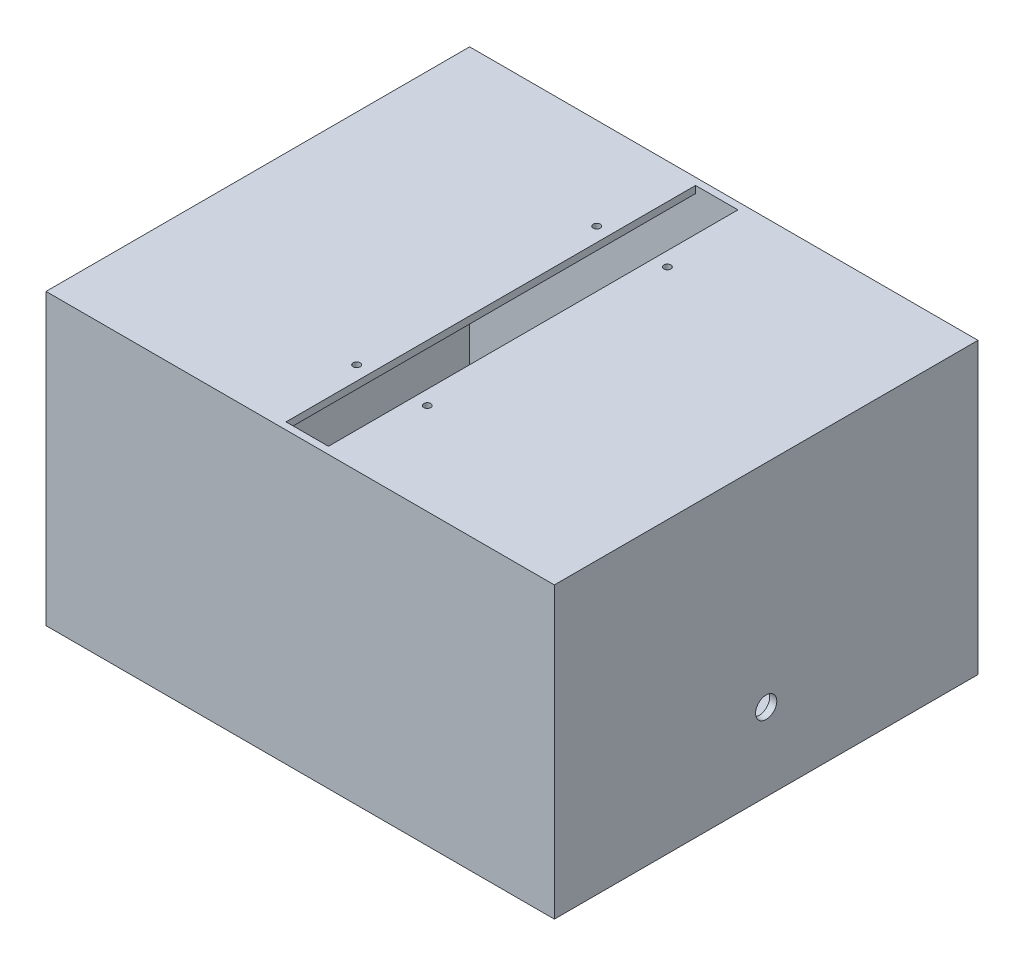
ISO-10303-21;
HEADER;
FILE_DESCRIPTION(('STEP AP214'),'2;1');
FILE_NAME('part.step','',(''),(''),'','','');
FILE_SCHEMA(('AUTOMOTIVE_DESIGN { 1 0 10303 214 1 1 1 1 }'));
ENDSEC;
DATA;
#1=APPLICATION_CONTEXT('core data for automotive mechanical design processes');
#2=APPLICATION_PROTOCOL_DEFINITION('international standard','automotive_design',2000,#1);
#3=PRODUCT_CONTEXT('',#1,'mechanical');
#4=PRODUCT('Part','Part','',(#3));
#5=PRODUCT_RELATED_PRODUCT_CATEGORY('part','',(#4));
#6=PRODUCT_DEFINITION_FORMATION('','',#4);
#7=PRODUCT_DEFINITION_CONTEXT('part definition',#1,'design');
#8=PRODUCT_DEFINITION('design','',#6,#7);
#9=PRODUCT_DEFINITION_SHAPE('','',#8);
#10=(LENGTH_UNIT() NAMED_UNIT(*) SI_UNIT(.MILLI.,.METRE.));
#11=(NAMED_UNIT(*) PLANE_ANGLE_UNIT() SI_UNIT($,.RADIAN.));
#12=(NAMED_UNIT(*) SI_UNIT($,.STERADIAN.) SOLID_ANGLE_UNIT());
#13=UNCERTAINTY_MEASURE_WITH_UNIT(LENGTH_MEASURE(1.E-05),#10,'distance_accuracy_value','');
#14=(GEOMETRIC_REPRESENTATION_CONTEXT(3) GLOBAL_UNCERTAINTY_ASSIGNED_CONTEXT((#13)) GLOBAL_UNIT_ASSIGNED_CONTEXT((#10,
#11,#12)) REPRESENTATION_CONTEXT('',''));
#15=CARTESIAN_POINT('',(0.,0.,0.));
#16=DIRECTION('',(0.,0.,1.));
#17=DIRECTION('',(1.,0.,0.));
#18=AXIS2_PLACEMENT_3D('',#15,#16,#17);
#19=CARTESIAN_POINT('',(0.,-5.,0.));
#20=DIRECTION('',(0.,1.,0.));
#21=DIRECTION('',(0.,0.,1.));
#22=AXIS2_PLACEMENT_3D('',#19,#20,#21);
#23=PLANE('',#22);
#24=CARTESIAN_POINT('',(25.,-5.,85.));
#25=DIRECTION('',(0.,1.,0.));
#26=DIRECTION('',(0.,0.,1.));
#27=AXIS2_PLACEMENT_3D('',#24,#25,#26);
#28=CIRCLE('',#27,2.5);
#29=CARTESIAN_POINT('',(25.,-5.,87.5));
#30=VERTEX_POINT('',#29);
#31=EDGE_CURVE('E225',#30,#30,#28,.F.);
#32=ORIENTED_EDGE('',*,*,#31,.F.);
#33=EDGE_LOOP('',(#32));
#34=FACE_BOUND('',#33,.T.);
#35=CARTESIAN_POINT('',(25.0000000000002,-5.,-85.));
#36=DIRECTION('',(0.,1.,0.));
#37=DIRECTION('',(0.,0.,1.));
#38=AXIS2_PLACEMENT_3D('',#35,#36,#37);
#39=CIRCLE('',#38,2.5);
#40=CARTESIAN_POINT('',(25.0000000000002,-5.,-82.5));
#41=VERTEX_POINT('',#40);
#42=EDGE_CURVE('E215',#41,#41,#39,.F.);
#43=ORIENTED_EDGE('',*,*,#42,.F.);
#44=EDGE_LOOP('',(#43));
#45=FACE_BOUND('',#44,.T.);
#46=DIRECTION('',(-1.,0.,0.));
#47=VECTOR('',#46,1.);
#48=CARTESIAN_POINT('',(-175.,-5.,145.));
#49=LINE('',#48,#47);
#50=CARTESIAN_POINT('',(175.,-5.,145.));
#51=VERTEX_POINT('',#50);
#52=CARTESIAN_POINT('',(15.,-5.,145.));
#53=VERTEX_POINT('',#52);
#54=EDGE_CURVE('E293',#51,#53,#49,.T.);
#55=ORIENTED_EDGE('',*,*,#54,.T.);
#56=DIRECTION('',(0.,0.,-1.));
#57=VECTOR('',#56,1.);
#58=CARTESIAN_POINT('',(15.,-5.,0.));
#59=LINE('',#58,#57);
#60=CARTESIAN_POINT('',(15.,-5.,-145.));
#61=VERTEX_POINT('',#60);
#62=EDGE_CURVE('E11',#53,#61,#59,.T.);
#63=ORIENTED_EDGE('',*,*,#62,.T.);
#64=DIRECTION('',(1.,0.,0.));
#65=VECTOR('',#64,1.);
#66=CARTESIAN_POINT('',(-175.,-5.,-145.));
#67=LINE('',#66,#65);
#68=CARTESIAN_POINT('',(175.,-5.,-145.));
#69=VERTEX_POINT('',#68);
#70=EDGE_CURVE('E301',#61,#69,#67,.T.);
#71=ORIENTED_EDGE('',*,*,#70,.T.);
#72=DIRECTION('',(0.,0.,1.));
#73=VECTOR('',#72,1.);
#74=CARTESIAN_POINT('',(175.,-5.,-145.));
#75=LINE('',#74,#73);
#76=EDGE_CURVE('E287',#69,#51,#75,.T.);
#77=ORIENTED_EDGE('',*,*,#76,.T.);
#78=EDGE_LOOP('',(#55,#63,#71,#77));
#79=FACE_BOUND('',#78,.T.);
#80=ADVANCED_FACE('F43',(#34,#45,#79),#23,.F.);
#81=CARTESIAN_POINT('',(-180.,-200.,150.));
#82=DIRECTION('',(-1.,0.,0.));
#83=DIRECTION('',(0.,0.,1.));
#84=AXIS2_PLACEMENT_3D('',#81,#82,#83);
#85=PLANE('',#84);
#86=CARTESIAN_POINT('',(-180.,-150.,0.));
#87=DIRECTION('',(-1.,0.,0.));
#88=DIRECTION('',(0.,0.,1.));
#89=AXIS2_PLACEMENT_3D('',#86,#87,#88);
#90=CIRCLE('',#89,7.5);
#91=CARTESIAN_POINT('',(-180.,-150.,7.50000000000002));
#92=VERTEX_POINT('',#91);
#93=EDGE_CURVE('E246',#92,#92,#90,.T.);
#94=ORIENTED_EDGE('',*,*,#93,.F.);
#95=EDGE_LOOP('',(#94));
#96=FACE_BOUND('',#95,.T.);
#97=DIRECTION('',(0.,0.,1.));
#98=VECTOR('',#97,1.);
#99=CARTESIAN_POINT('',(-180.,0.,150.));
#100=LINE('',#99,#98);
#101=CARTESIAN_POINT('',(-180.,0.,-150.));
#102=VERTEX_POINT('',#101);
#103=CARTESIAN_POINT('',(-180.,0.,150.));
#104=VERTEX_POINT('',#103);
#105=EDGE_CURVE('E326',#102,#104,#100,.T.);
#106=ORIENTED_EDGE('',*,*,#105,.F.);
#107=DIRECTION('',(0.,1.,0.));
#108=VECTOR('',#107,1.);
#109=CARTESIAN_POINT('',(-180.,-200.,-150.));
#110=LINE('',#109,#108);
#111=CARTESIAN_POINT('',(-180.,-205.,-150.));
#112=VERTEX_POINT('',#111);
#113=EDGE_CURVE('E354',#112,#102,#110,.T.);
#114=ORIENTED_EDGE('',*,*,#113,.F.);
#115=DIRECTION('',(0.,0.,-1.));
#116=VECTOR('',#115,1.);
#117=CARTESIAN_POINT('',(-180.,-205.,150.));
#118=LINE('',#117,#116);
#119=CARTESIAN_POINT('',(-180.,-205.,150.));
#120=VERTEX_POINT('',#119);
#121=EDGE_CURVE('E197',#120,#112,#118,.T.);
#122=ORIENTED_EDGE('',*,*,#121,.F.);
#123=DIRECTION('',(0.,1.,0.));
#124=VECTOR('',#123,1.);
#125=CARTESIAN_POINT('',(-180.,-200.,150.));
#126=LINE('',#125,#124);
#127=EDGE_CURVE('E353',#120,#104,#126,.T.);
#128=ORIENTED_EDGE('',*,*,#127,.T.);
#129=EDGE_LOOP('',(#106,#114,#122,#128));
#130=FACE_BOUND('',#129,.T.);
#131=ADVANCED_FACE('F45',(#96,#130),#85,.T.);
#132=CARTESIAN_POINT('',(-180.,-200.,-150.));
#133=DIRECTION('',(0.,0.,-1.));
#134=DIRECTION('',(-1.,0.,0.));
#135=AXIS2_PLACEMENT_3D('',#132,#133,#134);
#136=PLANE('',#135);
#137=DIRECTION('',(0.,1.,0.));
#138=VECTOR('',#137,1.);
#139=CARTESIAN_POINT('',(-100.,-200.,-150.));
#140=LINE('',#139,#138);
#141=CARTESIAN_POINT('',(-100.,-200.,-150.));
#142=VERTEX_POINT('',#141);
#143=CARTESIAN_POINT('',(-100.,-173.,-150.));
#144=VERTEX_POINT('',#143);
#145=EDGE_CURVE('E60',#142,#144,#140,.T.);
#146=ORIENTED_EDGE('',*,*,#145,.F.);
#147=DIRECTION('',(-1.,0.,0.));
#148=VECTOR('',#147,1.);
#149=CARTESIAN_POINT('',(99.9999999999999,-200.,-150.));
#150=LINE('',#149,#148);
#151=CARTESIAN_POINT('',(99.9999999999999,-200.,-150.));
#152=VERTEX_POINT('',#151);
#153=EDGE_CURVE('E181',#152,#142,#150,.T.);
#154=ORIENTED_EDGE('',*,*,#153,.F.);
#155=DIRECTION('',(0.,-1.,0.));
#156=VECTOR('',#155,1.);
#157=CARTESIAN_POINT('',(99.9999999999999,-200.,-150.));
#158=LINE('',#157,#156);
#159=CARTESIAN_POINT('',(99.9999999999999,-173.,-150.));
#160=VERTEX_POINT('',#159);
#161=EDGE_CURVE('E163',#160,#152,#158,.T.);
#162=ORIENTED_EDGE('',*,*,#161,.F.);
#163=DIRECTION('',(1.,0.,0.));
#164=VECTOR('',#163,1.);
#165=CARTESIAN_POINT('',(99.9999999999999,-173.,-150.));
#166=LINE('',#165,#164);
#167=EDGE_CURVE('E174',#144,#160,#166,.T.);
#168=ORIENTED_EDGE('',*,*,#167,.F.);
#169=EDGE_LOOP('',(#146,#154,#162,#168));
#170=FACE_BOUND('',#169,.T.);
#171=DIRECTION('',(-1.,0.,0.));
#172=VECTOR('',#171,1.);
#173=CARTESIAN_POINT('',(-180.,0.,-150.));
#174=LINE('',#173,#172);
#175=CARTESIAN_POINT('',(180.,0.,-150.));
#176=VERTEX_POINT('',#175);
#177=EDGE_CURVE('E349',#176,#102,#174,.T.);
#178=ORIENTED_EDGE('',*,*,#177,.F.);
#179=DIRECTION('',(0.,1.,0.));
#180=VECTOR('',#179,1.);
#181=CARTESIAN_POINT('',(180.,-200.,-150.));
#182=LINE('',#181,#180);
#183=CARTESIAN_POINT('',(180.,-205.,-150.));
#184=VERTEX_POINT('',#183);
#185=EDGE_CURVE('E357',#184,#176,#182,.T.);
#186=ORIENTED_EDGE('',*,*,#185,.F.);
#187=DIRECTION('',(1.,0.,0.));
#188=VECTOR('',#187,1.);
#189=CARTESIAN_POINT('',(-180.,-205.,-150.));
#190=LINE('',#189,#188);
#191=EDGE_CURVE('E202',#112,#184,#190,.T.);
#192=ORIENTED_EDGE('',*,*,#191,.F.);
#193=ORIENTED_EDGE('',*,*,#113,.T.);
#194=EDGE_LOOP('',(#178,#186,#192,#193));
#195=FACE_BOUND('',#194,.T.);
#196=ADVANCED_FACE('F179',(#170,#195),#136,.T.);
#197=CARTESIAN_POINT('',(180.,-200.,150.));
#198=DIRECTION('',(1.,0.,0.));
#199=DIRECTION('',(0.,0.,-1.));
#200=AXIS2_PLACEMENT_3D('',#197,#198,#199);
#201=PLANE('',#200);
#202=CARTESIAN_POINT('',(180.,-150.,0.));
#203=DIRECTION('',(-1.,0.,0.));
#204=DIRECTION('',(0.,0.,1.));
#205=AXIS2_PLACEMENT_3D('',#202,#203,#204);
#206=CIRCLE('',#205,7.5);
#207=CARTESIAN_POINT('',(180.,-150.,7.50000000000002));
#208=VERTEX_POINT('',#207);
#209=EDGE_CURVE('E247',#208,#208,#206,.T.);
#210=ORIENTED_EDGE('',*,*,#209,.T.);
#211=EDGE_LOOP('',(#210));
#212=FACE_BOUND('',#211,.T.);
#213=DIRECTION('',(0.,0.,-1.));
#214=VECTOR('',#213,1.);
#215=CARTESIAN_POINT('',(180.,0.,150.));
#216=LINE('',#215,#214);
#217=CARTESIAN_POINT('',(180.,0.,150.));
#218=VERTEX_POINT('',#217);
#219=EDGE_CURVE('E345',#218,#176,#216,.T.);
#220=ORIENTED_EDGE('',*,*,#219,.F.);
#221=DIRECTION('',(0.,1.,0.));
#222=VECTOR('',#221,1.);
#223=CARTESIAN_POINT('',(180.,-200.,150.));
#224=LINE('',#223,#222);
#225=CARTESIAN_POINT('',(180.,-205.,150.));
#226=VERTEX_POINT('',#225);
#227=EDGE_CURVE('E360',#226,#218,#224,.T.);
#228=ORIENTED_EDGE('',*,*,#227,.F.);
#229=DIRECTION('',(0.,0.,1.));
#230=VECTOR('',#229,1.);
#231=CARTESIAN_POINT('',(180.,-205.,150.));
#232=LINE('',#231,#230);
#233=EDGE_CURVE('E206',#184,#226,#232,.T.);
#234=ORIENTED_EDGE('',*,*,#233,.F.);
#235=ORIENTED_EDGE('',*,*,#185,.T.);
#236=EDGE_LOOP('',(#220,#228,#234,#235));
#237=FACE_BOUND('',#236,.T.);
#238=ADVANCED_FACE('F451',(#212,#237),#201,.T.);
#239=CARTESIAN_POINT('',(-180.,-200.,150.));
#240=DIRECTION('',(0.,0.,1.));
#241=DIRECTION('',(1.,0.,0.));
#242=AXIS2_PLACEMENT_3D('',#239,#240,#241);
#243=PLANE('',#242);
#244=DIRECTION('',(1.,0.,0.));
#245=VECTOR('',#244,1.);
#246=CARTESIAN_POINT('',(-180.,0.,150.));
#247=LINE('',#246,#245);
#248=EDGE_CURVE('E341',#104,#218,#247,.T.);
#249=ORIENTED_EDGE('',*,*,#248,.F.);
#250=ORIENTED_EDGE('',*,*,#127,.F.);
#251=DIRECTION('',(-1.,0.,0.));
#252=VECTOR('',#251,1.);
#253=CARTESIAN_POINT('',(-180.,-205.,150.));
#254=LINE('',#253,#252);
#255=EDGE_CURVE('E210',#226,#120,#254,.T.);
#256=ORIENTED_EDGE('',*,*,#255,.F.);
#257=ORIENTED_EDGE('',*,*,#227,.T.);
#258=EDGE_LOOP('',(#249,#250,#256,#257));
#259=FACE_BOUND('',#258,.T.);
#260=ADVANCED_FACE('F447',(#259),#243,.T.);
#261=CARTESIAN_POINT('',(0.,0.,0.));
#262=DIRECTION('',(0.,-1.,0.));
#263=DIRECTION('',(0.,0.,-1.));
#264=AXIS2_PLACEMENT_3D('',#261,#262,#263);
#265=PLANE('',#264);
#266=CARTESIAN_POINT('',(-25.0000000000001,0.,85.));
#267=DIRECTION('',(0.,1.,0.));
#268=DIRECTION('',(0.,0.,-1.));
#269=AXIS2_PLACEMENT_3D('',#266,#267,#268);
#270=CIRCLE('',#269,2.5);
#271=CARTESIAN_POINT('',(-25.0000000000001,0.,82.5));
#272=VERTEX_POINT('',#271);
#273=EDGE_CURVE('E229',#272,#272,#270,.T.);
#274=ORIENTED_EDGE('',*,*,#273,.F.);
#275=EDGE_LOOP('',(#274));
#276=FACE_BOUND('',#275,.T.);
#277=CARTESIAN_POINT('',(25.,0.,85.));
#278=DIRECTION('',(0.,1.,0.));
#279=DIRECTION('',(0.,0.,1.));
#280=AXIS2_PLACEMENT_3D('',#277,#278,#279);
#281=CIRCLE('',#280,2.5);
#282=CARTESIAN_POINT('',(25.,0.,87.5));
#283=VERTEX_POINT('',#282);
#284=EDGE_CURVE('E220',#283,#283,#281,.T.);
#285=ORIENTED_EDGE('',*,*,#284,.F.);
#286=EDGE_LOOP('',(#285));
#287=FACE_BOUND('',#286,.T.);
#288=CARTESIAN_POINT('',(25.0000000000002,0.,-85.));
#289=DIRECTION('',(0.,1.,0.));
#290=DIRECTION('',(0.,0.,-1.));
#291=AXIS2_PLACEMENT_3D('',#288,#289,#290);
#292=CIRCLE('',#291,2.5);
#293=CARTESIAN_POINT('',(25.0000000000002,0.,-87.5));
#294=VERTEX_POINT('',#293);
#295=EDGE_CURVE('E219',#294,#294,#292,.T.);
#296=ORIENTED_EDGE('',*,*,#295,.F.);
#297=EDGE_LOOP('',(#296));
#298=FACE_BOUND('',#297,.T.);
#299=CARTESIAN_POINT('',(-25.,0.,-85.));
#300=DIRECTION('',(0.,1.,0.));
#301=DIRECTION('',(0.,0.,1.));
#302=AXIS2_PLACEMENT_3D('',#299,#300,#301);
#303=CIRCLE('',#302,2.5);
#304=CARTESIAN_POINT('',(-25.,0.,-82.5));
#305=VERTEX_POINT('',#304);
#306=EDGE_CURVE('E224',#305,#305,#303,.T.);
#307=ORIENTED_EDGE('',*,*,#306,.F.);
#308=EDGE_LOOP('',(#307));
#309=FACE_BOUND('',#308,.T.);
#310=DIRECTION('',(-1.,0.,0.));
#311=VECTOR('',#310,1.);
#312=CARTESIAN_POINT('',(-15.,0.,-145.));
#313=LINE('',#312,#311);
#314=CARTESIAN_POINT('',(15.,0.,-145.));
#315=VERTEX_POINT('',#314);
#316=CARTESIAN_POINT('',(-15.,0.,-145.));
#317=VERTEX_POINT('',#316);
#318=EDGE_CURVE('E261',#315,#317,#313,.T.);
#319=ORIENTED_EDGE('',*,*,#318,.F.);
#320=DIRECTION('',(0.,0.,-1.));
#321=VECTOR('',#320,1.);
#322=CARTESIAN_POINT('',(15.,0.,145.));
#323=LINE('',#322,#321);
#324=CARTESIAN_POINT('',(15.,0.,145.));
#325=VERTEX_POINT('',#324);
#326=EDGE_CURVE('E258',#325,#315,#323,.T.);
#327=ORIENTED_EDGE('',*,*,#326,.F.);
#328=DIRECTION('',(1.,0.,0.));
#329=VECTOR('',#328,1.);
#330=CARTESIAN_POINT('',(-15.,0.,145.));
#331=LINE('',#330,#329);
#332=CARTESIAN_POINT('',(-15.,0.,145.));
#333=VERTEX_POINT('',#332);
#334=EDGE_CURVE('E269',#333,#325,#331,.T.);
#335=ORIENTED_EDGE('',*,*,#334,.F.);
#336=DIRECTION('',(0.,0.,1.));
#337=VECTOR('',#336,1.);
#338=CARTESIAN_POINT('',(-15.,0.,145.));
#339=LINE('',#338,#337);
#340=EDGE_CURVE('E265',#317,#333,#339,.T.);
#341=ORIENTED_EDGE('',*,*,#340,.F.);
#342=EDGE_LOOP('',(#319,#327,#335,#341));
#343=FACE_BOUND('',#342,.T.);
#344=ORIENTED_EDGE('',*,*,#105,.T.);
#345=ORIENTED_EDGE('',*,*,#248,.T.);
#346=ORIENTED_EDGE('',*,*,#219,.T.);
#347=ORIENTED_EDGE('',*,*,#177,.T.);
#348=EDGE_LOOP('',(#344,#345,#346,#347));
#349=FACE_BOUND('',#348,.T.);
#350=ADVANCED_FACE('F401',(#276,#287,#298,#309,#343,#349),#265,.F.);
#351=CARTESIAN_POINT('',(175.,-5.,-145.));
#352=DIRECTION('',(1.,0.,0.));
#353=DIRECTION('',(0.,0.,-1.));
#354=AXIS2_PLACEMENT_3D('',#351,#352,#353);
#355=PLANE('',#354);
#356=CARTESIAN_POINT('',(175.,-150.,0.));
#357=DIRECTION('',(1.,0.,0.));
#358=DIRECTION('',(0.,0.,-1.));
#359=AXIS2_PLACEMENT_3D('',#356,#357,#358);
#360=CIRCLE('',#359,7.5);
#361=CARTESIAN_POINT('',(175.,-150.,-7.49999999999998));
#362=VERTEX_POINT('',#361);
#363=EDGE_CURVE('E254',#362,#362,#360,.T.);
#364=ORIENTED_EDGE('',*,*,#363,.T.);
#365=EDGE_LOOP('',(#364));
#366=FACE_BOUND('',#365,.T.);
#367=DIRECTION('',(0.,0.,1.));
#368=VECTOR('',#367,1.);
#369=CARTESIAN_POINT('',(175.,-200.,-145.));
#370=LINE('',#369,#368);
#371=CARTESIAN_POINT('',(175.,-200.,-145.));
#372=VERTEX_POINT('',#371);
#373=CARTESIAN_POINT('',(175.,-200.,145.));
#374=VERTEX_POINT('',#373);
#375=EDGE_CURVE('E277',#372,#374,#370,.T.);
#376=ORIENTED_EDGE('',*,*,#375,.T.);
#377=DIRECTION('',(0.,-1.,0.));
#378=VECTOR('',#377,1.);
#379=CARTESIAN_POINT('',(175.,-5.,145.));
#380=LINE('',#379,#378);
#381=EDGE_CURVE('E306',#51,#374,#380,.T.);
#382=ORIENTED_EDGE('',*,*,#381,.F.);
#383=ORIENTED_EDGE('',*,*,#76,.F.);
#384=DIRECTION('',(0.,-1.,0.));
#385=VECTOR('',#384,1.);
#386=CARTESIAN_POINT('',(175.,-5.,-145.));
#387=LINE('',#386,#385);
#388=EDGE_CURVE('E322',#69,#372,#387,.T.);
#389=ORIENTED_EDGE('',*,*,#388,.T.);
#390=EDGE_LOOP('',(#376,#382,#383,#389));
#391=FACE_BOUND('',#390,.T.);
#392=ADVANCED_FACE('F410',(#366,#391),#355,.F.);
#393=CARTESIAN_POINT('',(-175.,-5.,-145.));
#394=DIRECTION('',(0.,0.,-1.));
#395=DIRECTION('',(-1.,0.,0.));
#396=AXIS2_PLACEMENT_3D('',#393,#394,#395);
#397=PLANE('',#396);
#398=DIRECTION('',(1.,0.,0.));
#399=VECTOR('',#398,1.);
#400=CARTESIAN_POINT('',(-175.,-200.,-145.));
#401=LINE('',#400,#399);
#402=CARTESIAN_POINT('',(-175.,-200.,-145.));
#403=VERTEX_POINT('',#402);
#404=CARTESIAN_POINT('',(-100.,-200.,-145.));
#405=VERTEX_POINT('',#404);
#406=EDGE_CURVE('E292',#403,#405,#401,.T.);
#407=ORIENTED_EDGE('',*,*,#406,.T.);
#408=DIRECTION('',(0.,-1.,0.));
#409=VECTOR('',#408,1.);
#410=CARTESIAN_POINT('',(-100.,-200.,-145.));
#411=LINE('',#410,#409);
#412=CARTESIAN_POINT('',(-100.,-173.,-145.));
#413=VERTEX_POINT('',#412);
#414=EDGE_CURVE('E198',#413,#405,#411,.T.);
#415=ORIENTED_EDGE('',*,*,#414,.F.);
#416=DIRECTION('',(-1.,0.,0.));
#417=VECTOR('',#416,1.);
#418=CARTESIAN_POINT('',(100.,-173.,-145.));
#419=LINE('',#418,#417);
#420=CARTESIAN_POINT('',(99.9999999999999,-173.,-145.));
#421=VERTEX_POINT('',#420);
#422=EDGE_CURVE('E194',#421,#413,#419,.T.);
#423=ORIENTED_EDGE('',*,*,#422,.F.);
#424=DIRECTION('',(0.,1.,0.));
#425=VECTOR('',#424,1.);
#426=CARTESIAN_POINT('',(99.9999999999999,-200.,-145.));
#427=LINE('',#426,#425);
#428=CARTESIAN_POINT('',(99.9999999999999,-200.,-145.));
#429=VERTEX_POINT('',#428);
#430=EDGE_CURVE('E166',#429,#421,#427,.T.);
#431=ORIENTED_EDGE('',*,*,#430,.F.);
#432=EDGE_CURVE('E318',#429,#372,#401,.T.);
#433=ORIENTED_EDGE('',*,*,#432,.T.);
#434=ORIENTED_EDGE('',*,*,#388,.F.);
#435=ORIENTED_EDGE('',*,*,#70,.F.);
#436=DIRECTION('',(0.,1.,0.));
#437=VECTOR('',#436,1.);
#438=CARTESIAN_POINT('',(15.,-200.,-145.));
#439=LINE('',#438,#437);
#440=EDGE_CURVE('E273',#61,#315,#439,.T.);
#441=ORIENTED_EDGE('',*,*,#440,.T.);
#442=ORIENTED_EDGE('',*,*,#318,.T.);
#443=DIRECTION('',(0.,1.,0.));
#444=VECTOR('',#443,1.);
#445=CARTESIAN_POINT('',(-15.,-200.,-145.));
#446=LINE('',#445,#444);
#447=CARTESIAN_POINT('',(-15.,-5.,-145.));
#448=VERTEX_POINT('',#447);
#449=EDGE_CURVE('E281',#448,#317,#446,.T.);
#450=ORIENTED_EDGE('',*,*,#449,.F.);
#451=CARTESIAN_POINT('',(-175.,-5.,-145.));
#452=VERTEX_POINT('',#451);
#453=EDGE_CURVE('E302',#452,#448,#67,.T.);
#454=ORIENTED_EDGE('',*,*,#453,.F.);
#455=DIRECTION('',(0.,-1.,0.));
#456=VECTOR('',#455,1.);
#457=CARTESIAN_POINT('',(-175.,-5.,-145.));
#458=LINE('',#457,#456);
#459=EDGE_CURVE('E327',#452,#403,#458,.T.);
#460=ORIENTED_EDGE('',*,*,#459,.T.);
#461=EDGE_LOOP('',(#407,#415,#423,#431,#433,#434,#435,#441,#442,#450,#454,#460));
#462=FACE_BOUND('',#461,.T.);
#463=ADVANCED_FACE('F389',(#462),#397,.F.);
#464=CARTESIAN_POINT('',(-175.,-5.,-145.));
#465=DIRECTION('',(-1.,0.,0.));
#466=DIRECTION('',(0.,0.,1.));
#467=AXIS2_PLACEMENT_3D('',#464,#465,#466);
#468=PLANE('',#467);
#469=CARTESIAN_POINT('',(-175.,-150.,0.));
#470=DIRECTION('',(-1.,0.,0.));
#471=DIRECTION('',(0.,0.,1.));
#472=AXIS2_PLACEMENT_3D('',#469,#470,#471);
#473=CIRCLE('',#472,7.5);
#474=CARTESIAN_POINT('',(-175.,-150.,7.50000000000002));
#475=VERTEX_POINT('',#474);
#476=EDGE_CURVE('E47',#475,#475,#473,.T.);
#477=ORIENTED_EDGE('',*,*,#476,.T.);
#478=EDGE_LOOP('',(#477));
#479=FACE_BOUND('',#478,.T.);
#480=DIRECTION('',(0.,0.,-1.));
#481=VECTOR('',#480,1.);
#482=CARTESIAN_POINT('',(-175.,-200.,-145.));
#483=LINE('',#482,#481);
#484=CARTESIAN_POINT('',(-175.,-200.,145.));
#485=VERTEX_POINT('',#484);
#486=EDGE_CURVE('E314',#485,#403,#483,.T.);
#487=ORIENTED_EDGE('',*,*,#486,.T.);
#488=ORIENTED_EDGE('',*,*,#459,.F.);
#489=DIRECTION('',(0.,0.,-1.));
#490=VECTOR('',#489,1.);
#491=CARTESIAN_POINT('',(-175.,-5.,-145.));
#492=LINE('',#491,#490);
#493=CARTESIAN_POINT('',(-175.,-5.,145.));
#494=VERTEX_POINT('',#493);
#495=EDGE_CURVE('E297',#494,#452,#492,.T.);
#496=ORIENTED_EDGE('',*,*,#495,.F.);
#497=DIRECTION('',(0.,-1.,0.));
#498=VECTOR('',#497,1.);
#499=CARTESIAN_POINT('',(-175.,-5.,145.));
#500=LINE('',#499,#498);
#501=EDGE_CURVE('E331',#494,#485,#500,.T.);
#502=ORIENTED_EDGE('',*,*,#501,.T.);
#503=EDGE_LOOP('',(#487,#488,#496,#502));
#504=FACE_BOUND('',#503,.T.);
#505=ADVANCED_FACE('F394',(#479,#504),#468,.F.);
#506=CARTESIAN_POINT('',(-175.,-5.,145.));
#507=DIRECTION('',(0.,0.,1.));
#508=DIRECTION('',(1.,0.,0.));
#509=AXIS2_PLACEMENT_3D('',#506,#507,#508);
#510=PLANE('',#509);
#511=CARTESIAN_POINT('',(-15.,-5.,145.));
#512=VERTEX_POINT('',#511);
#513=EDGE_CURVE('E291',#512,#494,#49,.T.);
#514=ORIENTED_EDGE('',*,*,#513,.F.);
#515=DIRECTION('',(0.,1.,0.));
#516=VECTOR('',#515,1.);
#517=CARTESIAN_POINT('',(-15.,-200.,145.));
#518=LINE('',#517,#516);
#519=EDGE_CURVE('E278',#512,#333,#518,.T.);
#520=ORIENTED_EDGE('',*,*,#519,.T.);
#521=ORIENTED_EDGE('',*,*,#334,.T.);
#522=DIRECTION('',(0.,1.,0.));
#523=VECTOR('',#522,1.);
#524=CARTESIAN_POINT('',(15.,-200.,145.));
#525=LINE('',#524,#523);
#526=EDGE_CURVE('E274',#53,#325,#525,.T.);
#527=ORIENTED_EDGE('',*,*,#526,.F.);
#528=ORIENTED_EDGE('',*,*,#54,.F.);
#529=ORIENTED_EDGE('',*,*,#381,.T.);
#530=DIRECTION('',(-1.,0.,0.));
#531=VECTOR('',#530,1.);
#532=CARTESIAN_POINT('',(-175.,-200.,145.));
#533=LINE('',#532,#531);
#534=EDGE_CURVE('E310',#374,#485,#533,.T.);
#535=ORIENTED_EDGE('',*,*,#534,.T.);
#536=ORIENTED_EDGE('',*,*,#501,.F.);
#537=EDGE_LOOP('',(#514,#520,#521,#527,#528,#529,#535,#536));
#538=FACE_BOUND('',#537,.T.);
#539=ADVANCED_FACE('F375',(#538),#510,.F.);
#540=CARTESIAN_POINT('',(-25.0000000000001,-5.,85.));
#541=DIRECTION('',(0.,1.,0.));
#542=DIRECTION('',(0.,0.,1.));
#543=AXIS2_PLACEMENT_3D('',#540,#541,#542);
#544=CIRCLE('',#543,2.5);
#545=CARTESIAN_POINT('',(-25.0000000000001,-5.,87.5));
#546=VERTEX_POINT('',#545);
#547=EDGE_CURVE('E214',#546,#546,#544,.F.);
#548=ORIENTED_EDGE('',*,*,#547,.F.);
#549=EDGE_LOOP('',(#548));
#550=FACE_BOUND('',#549,.T.);
#551=CARTESIAN_POINT('',(-25.,-5.,-85.));
#552=DIRECTION('',(0.,1.,0.));
#553=DIRECTION('',(0.,0.,1.));
#554=AXIS2_PLACEMENT_3D('',#551,#552,#553);
#555=CIRCLE('',#554,2.5);
#556=CARTESIAN_POINT('',(-25.,-5.,-82.5));
#557=VERTEX_POINT('',#556);
#558=EDGE_CURVE('E242',#557,#557,#555,.F.);
#559=ORIENTED_EDGE('',*,*,#558,.F.);
#560=EDGE_LOOP('',(#559));
#561=FACE_BOUND('',#560,.T.);
#562=ORIENTED_EDGE('',*,*,#453,.T.);
#563=DIRECTION('',(0.,0.,1.));
#564=VECTOR('',#563,1.);
#565=CARTESIAN_POINT('',(-15.,-5.,0.));
#566=LINE('',#565,#564);
#567=EDGE_CURVE('E53',#448,#512,#566,.T.);
#568=ORIENTED_EDGE('',*,*,#567,.T.);
#569=ORIENTED_EDGE('',*,*,#513,.T.);
#570=ORIENTED_EDGE('',*,*,#495,.T.);
#571=EDGE_LOOP('',(#562,#568,#569,#570));
#572=FACE_BOUND('',#571,.T.);
#573=ADVANCED_FACE('F370',(#550,#561,#572),#23,.F.);
#574=CARTESIAN_POINT('',(15.,-200.,145.));
#575=DIRECTION('',(1.,0.,0.));
#576=DIRECTION('',(0.,0.,-1.));
#577=AXIS2_PLACEMENT_3D('',#574,#575,#576);
#578=PLANE('',#577);
#579=ORIENTED_EDGE('',*,*,#526,.T.);
#580=ORIENTED_EDGE('',*,*,#326,.T.);
#581=ORIENTED_EDGE('',*,*,#440,.F.);
#582=ORIENTED_EDGE('',*,*,#62,.F.);
#583=EDGE_LOOP('',(#579,#580,#581,#582));
#584=FACE_BOUND('',#583,.T.);
#585=ADVANCED_FACE('F413',(#584),#578,.F.);
#586=CARTESIAN_POINT('',(-15.,-200.,145.));
#587=DIRECTION('',(-1.,0.,0.));
#588=DIRECTION('',(0.,0.,1.));
#589=AXIS2_PLACEMENT_3D('',#586,#587,#588);
#590=PLANE('',#589);
#591=ORIENTED_EDGE('',*,*,#449,.T.);
#592=ORIENTED_EDGE('',*,*,#340,.T.);
#593=ORIENTED_EDGE('',*,*,#519,.F.);
#594=ORIENTED_EDGE('',*,*,#567,.F.);
#595=EDGE_LOOP('',(#591,#592,#593,#594));
#596=FACE_BOUND('',#595,.T.);
#597=ADVANCED_FACE('F397',(#596),#590,.F.);
#598=CARTESIAN_POINT('',(180.,-150.,0.));
#599=DIRECTION('',(-1.,0.,0.));
#600=DIRECTION('',(0.,0.,1.));
#601=AXIS2_PLACEMENT_3D('',#598,#599,#600);
#602=CYLINDRICAL_SURFACE('',#601,7.5);
#603=ORIENTED_EDGE('',*,*,#93,.T.);
#604=EDGE_LOOP('',(#603));
#605=FACE_BOUND('',#604,.T.);
#606=ORIENTED_EDGE('',*,*,#476,.F.);
#607=EDGE_LOOP('',(#606));
#608=FACE_BOUND('',#607,.T.);
#609=ADVANCED_FACE('F420',(#605,#608),#602,.F.);
#610=ORIENTED_EDGE('',*,*,#209,.F.);
#611=EDGE_LOOP('',(#610));
#612=FACE_BOUND('',#611,.T.);
#613=ORIENTED_EDGE('',*,*,#363,.F.);
#614=EDGE_LOOP('',(#613));
#615=FACE_BOUND('',#614,.T.);
#616=ADVANCED_FACE('F495',(#612,#615),#602,.F.);
#617=CARTESIAN_POINT('',(-25.,-12.0710678118655,-85.));
#618=DIRECTION('',(0.,1.,0.));
#619=DIRECTION('',(0.,0.,1.));
#620=AXIS2_PLACEMENT_3D('',#617,#618,#619);
#621=CYLINDRICAL_SURFACE('',#620,2.5);
#622=ORIENTED_EDGE('',*,*,#558,.T.);
#623=EDGE_LOOP('',(#622));
#624=FACE_BOUND('',#623,.T.);
#625=ORIENTED_EDGE('',*,*,#306,.T.);
#626=EDGE_LOOP('',(#625));
#627=FACE_BOUND('',#626,.T.);
#628=ADVANCED_FACE('F491',(#624,#627),#621,.F.);
#629=CARTESIAN_POINT('',(-25.0000000000001,-12.0710678118655,85.));
#630=DIRECTION('',(0.,1.,0.));
#631=DIRECTION('',(0.,0.,1.));
#632=AXIS2_PLACEMENT_3D('',#629,#630,#631);
#633=CYLINDRICAL_SURFACE('',#632,2.5);
#634=ORIENTED_EDGE('',*,*,#547,.T.);
#635=EDGE_LOOP('',(#634));
#636=FACE_BOUND('',#635,.T.);
#637=ORIENTED_EDGE('',*,*,#273,.T.);
#638=EDGE_LOOP('',(#637));
#639=FACE_BOUND('',#638,.T.);
#640=ADVANCED_FACE('F484',(#636,#639),#633,.F.);
#641=CARTESIAN_POINT('',(25.0000000000002,-12.0710678118655,-85.));
#642=DIRECTION('',(0.,1.,0.));
#643=DIRECTION('',(0.,0.,1.));
#644=AXIS2_PLACEMENT_3D('',#641,#642,#643);
#645=CYLINDRICAL_SURFACE('',#644,2.5);
#646=ORIENTED_EDGE('',*,*,#42,.T.);
#647=EDGE_LOOP('',(#646));
#648=FACE_BOUND('',#647,.T.);
#649=ORIENTED_EDGE('',*,*,#295,.T.);
#650=EDGE_LOOP('',(#649));
#651=FACE_BOUND('',#650,.T.);
#652=ADVANCED_FACE('F481',(#648,#651),#645,.F.);
#653=CARTESIAN_POINT('',(25.,-12.0710678118655,85.));
#654=DIRECTION('',(0.,1.,0.));
#655=DIRECTION('',(0.,0.,1.));
#656=AXIS2_PLACEMENT_3D('',#653,#654,#655);
#657=CYLINDRICAL_SURFACE('',#656,2.5);
#658=ORIENTED_EDGE('',*,*,#31,.T.);
#659=EDGE_LOOP('',(#658));
#660=FACE_BOUND('',#659,.T.);
#661=ORIENTED_EDGE('',*,*,#284,.T.);
#662=EDGE_LOOP('',(#661));
#663=FACE_BOUND('',#662,.T.);
#664=ADVANCED_FACE('F477',(#660,#663),#657,.F.);
#665=CARTESIAN_POINT('',(0.,-200.,0.));
#666=DIRECTION('',(0.,-1.,0.));
#667=DIRECTION('',(0.,0.,-1.));
#668=AXIS2_PLACEMENT_3D('',#665,#666,#667);
#669=PLANE('',#668);
#670=ORIENTED_EDGE('',*,*,#375,.F.);
#671=ORIENTED_EDGE('',*,*,#432,.F.);
#672=DIRECTION('',(0.,0.,-1.));
#673=VECTOR('',#672,1.);
#674=CARTESIAN_POINT('',(100.,-200.,56.8142710513803));
#675=LINE('',#674,#673);
#676=EDGE_CURVE('E170',#429,#152,#675,.T.);
#677=ORIENTED_EDGE('',*,*,#676,.T.);
#678=ORIENTED_EDGE('',*,*,#153,.T.);
#679=DIRECTION('',(0.,0.,-1.));
#680=VECTOR('',#679,1.);
#681=CARTESIAN_POINT('',(-100.,-200.,56.8142710513803));
#682=LINE('',#681,#680);
#683=EDGE_CURVE('E67',#405,#142,#682,.T.);
#684=ORIENTED_EDGE('',*,*,#683,.F.);
#685=ORIENTED_EDGE('',*,*,#406,.F.);
#686=ORIENTED_EDGE('',*,*,#486,.F.);
#687=ORIENTED_EDGE('',*,*,#534,.F.);
#688=EDGE_LOOP('',(#670,#671,#677,#678,#684,#685,#686,#687));
#689=FACE_BOUND('',#688,.T.);
#690=ADVANCED_FACE('F391',(#689),#669,.F.);
#691=CARTESIAN_POINT('',(0.,-205.,0.));
#692=DIRECTION('',(0.,-1.,0.));
#693=DIRECTION('',(0.,0.,-1.));
#694=AXIS2_PLACEMENT_3D('',#691,#692,#693);
#695=PLANE('',#694);
#696=ORIENTED_EDGE('',*,*,#121,.T.);
#697=ORIENTED_EDGE('',*,*,#191,.T.);
#698=ORIENTED_EDGE('',*,*,#233,.T.);
#699=ORIENTED_EDGE('',*,*,#255,.T.);
#700=EDGE_LOOP('',(#696,#697,#698,#699));
#701=FACE_BOUND('',#700,.T.);
#702=ADVANCED_FACE('F468',(#701),#695,.T.);
#703=CARTESIAN_POINT('',(-100.,-200.,56.8142710513803));
#704=DIRECTION('',(-1.,0.,0.));
#705=DIRECTION('',(0.,0.,1.));
#706=AXIS2_PLACEMENT_3D('',#703,#704,#705);
#707=PLANE('',#706);
#708=ORIENTED_EDGE('',*,*,#414,.T.);
#709=ORIENTED_EDGE('',*,*,#683,.T.);
#710=ORIENTED_EDGE('',*,*,#145,.T.);
#711=DIRECTION('',(0.,0.,-1.));
#712=VECTOR('',#711,1.);
#713=CARTESIAN_POINT('',(-100.,-173.,56.8142710513803));
#714=LINE('',#713,#712);
#715=EDGE_CURVE('E171',#413,#144,#714,.T.);
#716=ORIENTED_EDGE('',*,*,#715,.F.);
#717=EDGE_LOOP('',(#708,#709,#710,#716));
#718=FACE_BOUND('',#717,.T.);
#719=ADVANCED_FACE('F387',(#718),#707,.F.);
#720=CARTESIAN_POINT('',(100.,-200.,56.8142710513803));
#721=DIRECTION('',(1.,0.,0.));
#722=DIRECTION('',(0.,0.,-1.));
#723=AXIS2_PLACEMENT_3D('',#720,#721,#722);
#724=PLANE('',#723);
#725=ORIENTED_EDGE('',*,*,#430,.T.);
#726=DIRECTION('',(0.,0.,-1.));
#727=VECTOR('',#726,1.);
#728=CARTESIAN_POINT('',(100.,-173.,56.8142710513803));
#729=LINE('',#728,#727);
#730=EDGE_CURVE('E159',#421,#160,#729,.T.);
#731=ORIENTED_EDGE('',*,*,#730,.T.);
#732=ORIENTED_EDGE('',*,*,#161,.T.);
#733=ORIENTED_EDGE('',*,*,#676,.F.);
#734=EDGE_LOOP('',(#725,#731,#732,#733));
#735=FACE_BOUND('',#734,.T.);
#736=ADVANCED_FACE('F161',(#735),#724,.F.);
#737=CARTESIAN_POINT('',(100.,-173.,56.8142710513803));
#738=DIRECTION('',(0.,1.,0.));
#739=DIRECTION('',(0.,0.,1.));
#740=AXIS2_PLACEMENT_3D('',#737,#738,#739);
#741=PLANE('',#740);
#742=ORIENTED_EDGE('',*,*,#422,.T.);
#743=ORIENTED_EDGE('',*,*,#715,.T.);
#744=ORIENTED_EDGE('',*,*,#167,.T.);
#745=ORIENTED_EDGE('',*,*,#730,.F.);
#746=EDGE_LOOP('',(#742,#743,#744,#745));
#747=FACE_BOUND('',#746,.T.);
#748=ADVANCED_FACE('F175',(#747),#741,.F.);
#749=CLOSED_SHELL('',(#80,#131,#196,#238,#260,#350,#392,#463,#505,#539,#573,#585,#597,#609,#616,
#628,#640,#652,#664,#690,#702,#719,#736,#748));
#750=MANIFOLD_SOLID_BREP('B2',#749);
#751=ADVANCED_BREP_SHAPE_REPRESENTATION('',(#18,#750),#14);
#752=SHAPE_DEFINITION_REPRESENTATION(#9,#751);
ENDSEC;
END-ISO-10303-21;
